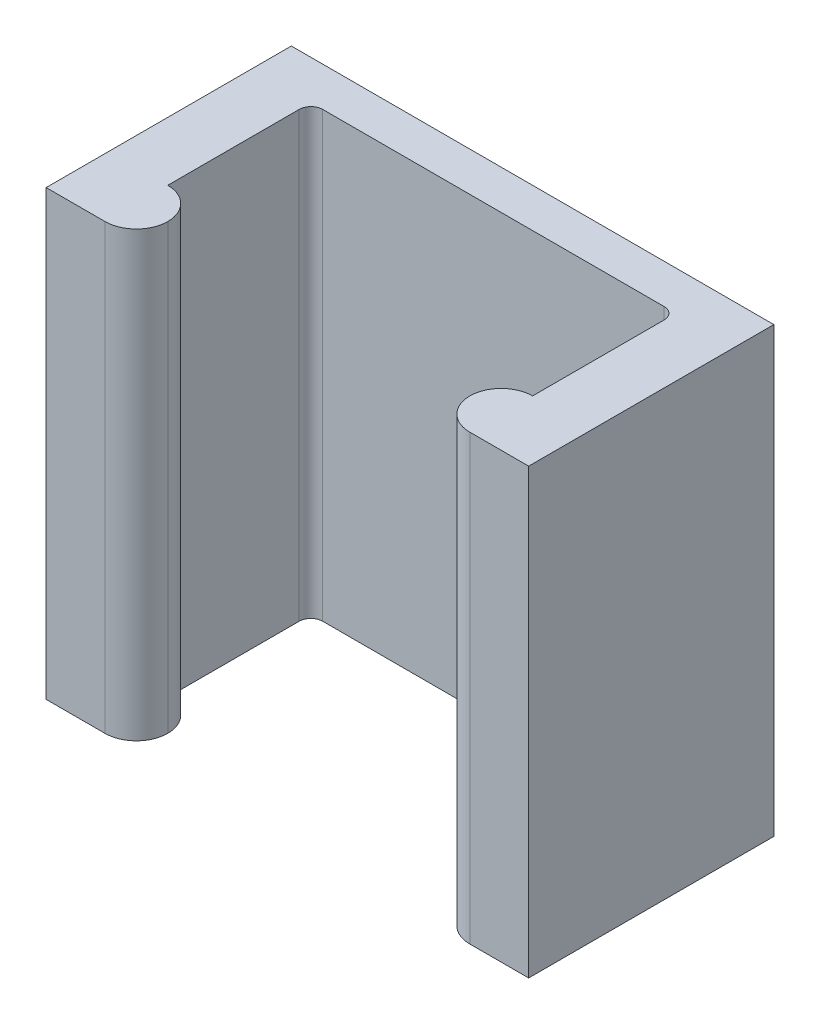
ISO-10303-21;
HEADER;
FILE_DESCRIPTION(('STEP AP214'),'2;1');
FILE_NAME('part.step','',(''),(''),'','','');
FILE_SCHEMA(('AUTOMOTIVE_DESIGN { 1 0 10303 214 1 1 1 1 }'));
ENDSEC;
DATA;
#1=APPLICATION_CONTEXT('core data for automotive mechanical design processes');
#2=APPLICATION_PROTOCOL_DEFINITION('international standard','automotive_design',2000,#1);
#3=PRODUCT_CONTEXT('',#1,'mechanical');
#4=PRODUCT('Part','Part','',(#3));
#5=PRODUCT_RELATED_PRODUCT_CATEGORY('part','',(#4));
#6=PRODUCT_DEFINITION_FORMATION('','',#4);
#7=PRODUCT_DEFINITION_CONTEXT('part definition',#1,'design');
#8=PRODUCT_DEFINITION('design','',#6,#7);
#9=PRODUCT_DEFINITION_SHAPE('','',#8);
#10=(LENGTH_UNIT() NAMED_UNIT(*) SI_UNIT(.MILLI.,.METRE.));
#11=(NAMED_UNIT(*) PLANE_ANGLE_UNIT() SI_UNIT($,.RADIAN.));
#12=(NAMED_UNIT(*) SI_UNIT($,.STERADIAN.) SOLID_ANGLE_UNIT());
#13=UNCERTAINTY_MEASURE_WITH_UNIT(LENGTH_MEASURE(1.E-05),#10,'distance_accuracy_value','');
#14=(GEOMETRIC_REPRESENTATION_CONTEXT(3) GLOBAL_UNCERTAINTY_ASSIGNED_CONTEXT((#13)) GLOBAL_UNIT_ASSIGNED_CONTEXT((#10,
#11,#12)) REPRESENTATION_CONTEXT('',''));
#15=CARTESIAN_POINT('',(0.,0.,0.));
#16=DIRECTION('',(0.,0.,1.));
#17=DIRECTION('',(1.,0.,0.));
#18=AXIS2_PLACEMENT_3D('',#15,#16,#17);
#19=CARTESIAN_POINT('',(4.65,5.65,6.25));
#20=DIRECTION('',(1.,0.,0.));
#21=DIRECTION('',(0.,1.,0.));
#22=AXIS2_PLACEMENT_3D('',#19,#20,#21);
#23=PLANE('',#22);
#24=DIRECTION('',(0.,0.,-1.));
#25=VECTOR('',#24,1.);
#26=CARTESIAN_POINT('',(4.65,5.65,6.25));
#27=LINE('',#26,#25);
#28=CARTESIAN_POINT('',(4.65,5.65,4.65));
#29=VERTEX_POINT('',#28);
#30=CARTESIAN_POINT('',(4.65,5.65,1.3));
#31=VERTEX_POINT('',#30);
#32=EDGE_CURVE('E146',#29,#31,#27,.T.);
#33=ORIENTED_EDGE('',*,*,#32,.T.);
#34=DIRECTION('',(0.,1.,0.));
#35=VECTOR('',#34,1.);
#36=CARTESIAN_POINT('',(4.65,-5.65,1.3));
#37=LINE('',#36,#35);
#38=CARTESIAN_POINT('',(4.65,-5.65,1.3));
#39=VERTEX_POINT('',#38);
#40=EDGE_CURVE('E214',#31,#39,#37,.F.);
#41=ORIENTED_EDGE('',*,*,#40,.T.);
#42=DIRECTION('',(0.,0.,-1.));
#43=VECTOR('',#42,1.);
#44=CARTESIAN_POINT('',(4.65,-5.65,6.25));
#45=LINE('',#44,#43);
#46=CARTESIAN_POINT('',(4.65,-5.65,4.65));
#47=VERTEX_POINT('',#46);
#48=EDGE_CURVE('E149',#47,#39,#45,.T.);
#49=ORIENTED_EDGE('',*,*,#48,.F.);
#50=DIRECTION('',(0.,-1.,0.));
#51=VECTOR('',#50,1.);
#52=CARTESIAN_POINT('',(4.65,-5.65,4.65));
#53=LINE('',#52,#51);
#54=EDGE_CURVE('E144',#29,#47,#53,.T.);
#55=ORIENTED_EDGE('',*,*,#54,.F.);
#56=EDGE_LOOP('',(#33,#41,#49,#55));
#57=FACE_BOUND('',#56,.T.);
#58=ADVANCED_FACE('F41',(#57),#23,.F.);
#59=CARTESIAN_POINT('',(-4.65,5.65,6.25));
#60=DIRECTION('',(-1.,0.,0.));
#61=DIRECTION('',(0.,-1.,0.));
#62=AXIS2_PLACEMENT_3D('',#59,#60,#61);
#63=PLANE('',#62);
#64=DIRECTION('',(0.,0.,-1.));
#65=VECTOR('',#64,1.);
#66=CARTESIAN_POINT('',(-4.65,-5.65,6.25));
#67=LINE('',#66,#65);
#68=CARTESIAN_POINT('',(-4.65,-5.65,4.65));
#69=VERTEX_POINT('',#68);
#70=CARTESIAN_POINT('',(-4.65,-5.65,1.3));
#71=VERTEX_POINT('',#70);
#72=EDGE_CURVE('E326',#69,#71,#67,.T.);
#73=ORIENTED_EDGE('',*,*,#72,.T.);
#74=DIRECTION('',(0.,-1.,0.));
#75=VECTOR('',#74,1.);
#76=CARTESIAN_POINT('',(-4.65,5.65,1.3));
#77=LINE('',#76,#75);
#78=CARTESIAN_POINT('',(-4.65,5.65,1.3));
#79=VERTEX_POINT('',#78);
#80=EDGE_CURVE('E57',#71,#79,#77,.F.);
#81=ORIENTED_EDGE('',*,*,#80,.T.);
#82=DIRECTION('',(0.,0.,-1.));
#83=VECTOR('',#82,1.);
#84=CARTESIAN_POINT('',(-4.65,5.65,6.25));
#85=LINE('',#84,#83);
#86=CARTESIAN_POINT('',(-4.65,5.65,4.65));
#87=VERTEX_POINT('',#86);
#88=EDGE_CURVE('E323',#87,#79,#85,.T.);
#89=ORIENTED_EDGE('',*,*,#88,.F.);
#90=DIRECTION('',(0.,1.,0.));
#91=VECTOR('',#90,1.);
#92=CARTESIAN_POINT('',(-4.65,5.65,4.65));
#93=LINE('',#92,#91);
#94=EDGE_CURVE('E154',#69,#87,#93,.T.);
#95=ORIENTED_EDGE('',*,*,#94,.F.);
#96=EDGE_LOOP('',(#73,#81,#89,#95));
#97=FACE_BOUND('',#96,.T.);
#98=ADVANCED_FACE('F251',(#97),#63,.F.);
#99=CARTESIAN_POINT('',(6.15,-5.65,2.));
#100=DIRECTION('',(-1.,0.,0.));
#101=DIRECTION('',(0.,0.,1.));
#102=AXIS2_PLACEMENT_3D('',#99,#100,#101);
#103=PLANE('',#102);
#104=DIRECTION('',(0.,1.,0.));
#105=VECTOR('',#104,1.);
#106=CARTESIAN_POINT('',(6.15,-5.65,0.));
#107=LINE('',#106,#105);
#108=CARTESIAN_POINT('',(6.15,-5.65,0.));
#109=VERTEX_POINT('',#108);
#110=CARTESIAN_POINT('',(6.15,5.65,0.));
#111=VERTEX_POINT('',#110);
#112=EDGE_CURVE('E329',#109,#111,#107,.T.);
#113=ORIENTED_EDGE('',*,*,#112,.T.);
#114=DIRECTION('',(0.,0.,-1.));
#115=VECTOR('',#114,1.);
#116=CARTESIAN_POINT('',(6.15,5.65,2.));
#117=LINE('',#116,#115);
#118=CARTESIAN_POINT('',(6.15,5.65,6.25));
#119=VERTEX_POINT('',#118);
#120=EDGE_CURVE('E236',#119,#111,#117,.T.);
#121=ORIENTED_EDGE('',*,*,#120,.F.);
#122=DIRECTION('',(0.,1.,0.));
#123=VECTOR('',#122,1.);
#124=CARTESIAN_POINT('',(6.15,5.65,6.25));
#125=LINE('',#124,#123);
#126=CARTESIAN_POINT('',(6.15,-5.65,6.25));
#127=VERTEX_POINT('',#126);
#128=EDGE_CURVE('E298',#127,#119,#125,.T.);
#129=ORIENTED_EDGE('',*,*,#128,.F.);
#130=DIRECTION('',(0.,0.,-1.));
#131=VECTOR('',#130,1.);
#132=CARTESIAN_POINT('',(6.15,-5.65,2.));
#133=LINE('',#132,#131);
#134=EDGE_CURVE('E342',#127,#109,#133,.T.);
#135=ORIENTED_EDGE('',*,*,#134,.T.);
#136=EDGE_LOOP('',(#113,#121,#129,#135));
#137=FACE_BOUND('',#136,.T.);
#138=ADVANCED_FACE('F256',(#137),#103,.F.);
#139=CARTESIAN_POINT('',(-6.15,5.65,2.));
#140=DIRECTION('',(0.,-1.,0.));
#141=DIRECTION('',(0.,0.,-1.));
#142=AXIS2_PLACEMENT_3D('',#139,#140,#141);
#143=PLANE('',#142);
#144=CARTESIAN_POINT('',(4.65,5.65,5.45));
#145=DIRECTION('',(0.,-1.,0.));
#146=DIRECTION('',(0.,0.,-1.));
#147=AXIS2_PLACEMENT_3D('',#144,#145,#146);
#148=CIRCLE('',#147,0.8);
#149=CARTESIAN_POINT('',(3.85,5.65,5.45));
#150=VERTEX_POINT('',#149);
#151=EDGE_CURVE('E159',#29,#150,#148,.F.);
#152=ORIENTED_EDGE('',*,*,#151,.T.);
#153=CARTESIAN_POINT('',(4.65,5.65,5.45));
#154=DIRECTION('',(0.,-1.,0.));
#155=DIRECTION('',(0.,0.,-1.));
#156=AXIS2_PLACEMENT_3D('',#153,#154,#155);
#157=CIRCLE('',#156,0.8);
#158=CARTESIAN_POINT('',(4.65,5.65,6.25));
#159=VERTEX_POINT('',#158);
#160=EDGE_CURVE('E170',#150,#159,#157,.F.);
#161=ORIENTED_EDGE('',*,*,#160,.T.);
#162=DIRECTION('',(-1.,0.,0.));
#163=VECTOR('',#162,1.);
#164=CARTESIAN_POINT('',(6.15,5.65,6.25));
#165=LINE('',#164,#163);
#166=EDGE_CURVE('E304',#119,#159,#165,.T.);
#167=ORIENTED_EDGE('',*,*,#166,.F.);
#168=ORIENTED_EDGE('',*,*,#120,.T.);
#169=DIRECTION('',(-1.,0.,0.));
#170=VECTOR('',#169,1.);
#171=CARTESIAN_POINT('',(-6.15,5.65,0.));
#172=LINE('',#171,#170);
#173=CARTESIAN_POINT('',(-6.15,5.65,0.));
#174=VERTEX_POINT('',#173);
#175=EDGE_CURVE('E333',#111,#174,#172,.T.);
#176=ORIENTED_EDGE('',*,*,#175,.T.);
#177=DIRECTION('',(0.,0.,-1.));
#178=VECTOR('',#177,1.);
#179=CARTESIAN_POINT('',(-6.15,5.65,2.));
#180=LINE('',#179,#178);
#181=CARTESIAN_POINT('',(-6.15,5.65,6.25));
#182=VERTEX_POINT('',#181);
#183=EDGE_CURVE('E350',#182,#174,#180,.T.);
#184=ORIENTED_EDGE('',*,*,#183,.F.);
#185=DIRECTION('',(-1.,0.,0.));
#186=VECTOR('',#185,1.);
#187=CARTESIAN_POINT('',(-6.15,5.65,6.25));
#188=LINE('',#187,#186);
#189=CARTESIAN_POINT('',(-4.65,5.65,6.25));
#190=VERTEX_POINT('',#189);
#191=EDGE_CURVE('E320',#190,#182,#188,.T.);
#192=ORIENTED_EDGE('',*,*,#191,.F.);
#193=CARTESIAN_POINT('',(-4.65,5.65,5.45));
#194=DIRECTION('',(0.,-1.,0.));
#195=DIRECTION('',(0.,0.,-1.));
#196=AXIS2_PLACEMENT_3D('',#193,#194,#195);
#197=CIRCLE('',#196,0.8);
#198=CARTESIAN_POINT('',(-3.85,5.65,5.45));
#199=VERTEX_POINT('',#198);
#200=EDGE_CURVE('E171',#190,#199,#197,.F.);
#201=ORIENTED_EDGE('',*,*,#200,.T.);
#202=CARTESIAN_POINT('',(-4.65,5.65,5.45));
#203=DIRECTION('',(0.,-1.,0.));
#204=DIRECTION('',(0.,0.,-1.));
#205=AXIS2_PLACEMENT_3D('',#202,#203,#204);
#206=CIRCLE('',#205,0.8);
#207=EDGE_CURVE('E177',#199,#87,#206,.F.);
#208=ORIENTED_EDGE('',*,*,#207,.T.);
#209=ORIENTED_EDGE('',*,*,#88,.T.);
#210=CARTESIAN_POINT('',(-4.35,5.65,1.3));
#211=DIRECTION('',(0.,-1.,0.));
#212=DIRECTION('',(0.,0.,-1.));
#213=AXIS2_PLACEMENT_3D('',#210,#211,#212);
#214=CIRCLE('',#213,0.3);
#215=CARTESIAN_POINT('',(-4.35,5.65,1.));
#216=VERTEX_POINT('',#215);
#217=EDGE_CURVE('E11',#79,#216,#214,.T.);
#218=ORIENTED_EDGE('',*,*,#217,.T.);
#219=DIRECTION('',(1.,0.,0.));
#220=VECTOR('',#219,1.);
#221=CARTESIAN_POINT('',(-6.15,5.65,1.));
#222=LINE('',#221,#220);
#223=CARTESIAN_POINT('',(4.35,5.65,1.));
#224=VERTEX_POINT('',#223);
#225=EDGE_CURVE('E295',#216,#224,#222,.T.);
#226=ORIENTED_EDGE('',*,*,#225,.T.);
#227=CARTESIAN_POINT('',(4.35,5.65,1.3));
#228=DIRECTION('',(0.,-1.,0.));
#229=DIRECTION('',(0.,0.,-1.));
#230=AXIS2_PLACEMENT_3D('',#227,#228,#229);
#231=CIRCLE('',#230,0.3);
#232=EDGE_CURVE('E162',#224,#31,#231,.T.);
#233=ORIENTED_EDGE('',*,*,#232,.T.);
#234=ORIENTED_EDGE('',*,*,#32,.F.);
#235=EDGE_LOOP('',(#152,#161,#167,#168,#176,#184,#192,#201,#208,#209,#218,#226,#233,#234));
#236=FACE_BOUND('',#235,.T.);
#237=ADVANCED_FACE('F158',(#236),#143,.F.);
#238=CARTESIAN_POINT('',(-6.15,-5.65,2.));
#239=DIRECTION('',(1.,0.,0.));
#240=DIRECTION('',(0.,0.,-1.));
#241=AXIS2_PLACEMENT_3D('',#238,#239,#240);
#242=PLANE('',#241);
#243=DIRECTION('',(0.,-1.,0.));
#244=VECTOR('',#243,1.);
#245=CARTESIAN_POINT('',(-6.15,-5.65,0.));
#246=LINE('',#245,#244);
#247=CARTESIAN_POINT('',(-6.15,-5.65,0.));
#248=VERTEX_POINT('',#247);
#249=EDGE_CURVE('E336',#174,#248,#246,.T.);
#250=ORIENTED_EDGE('',*,*,#249,.T.);
#251=DIRECTION('',(0.,0.,-1.));
#252=VECTOR('',#251,1.);
#253=CARTESIAN_POINT('',(-6.15,-5.65,2.));
#254=LINE('',#253,#252);
#255=CARTESIAN_POINT('',(-6.15,-5.65,6.25));
#256=VERTEX_POINT('',#255);
#257=EDGE_CURVE('E346',#256,#248,#254,.T.);
#258=ORIENTED_EDGE('',*,*,#257,.F.);
#259=DIRECTION('',(0.,-1.,0.));
#260=VECTOR('',#259,1.);
#261=CARTESIAN_POINT('',(-6.15,5.65,6.25));
#262=LINE('',#261,#260);
#263=EDGE_CURVE('E164',#182,#256,#262,.T.);
#264=ORIENTED_EDGE('',*,*,#263,.F.);
#265=ORIENTED_EDGE('',*,*,#183,.T.);
#266=EDGE_LOOP('',(#250,#258,#264,#265));
#267=FACE_BOUND('',#266,.T.);
#268=ADVANCED_FACE('F272',(#267),#242,.F.);
#269=CARTESIAN_POINT('',(-6.15,-5.65,2.));
#270=DIRECTION('',(0.,1.,0.));
#271=DIRECTION('',(0.,0.,1.));
#272=AXIS2_PLACEMENT_3D('',#269,#270,#271);
#273=PLANE('',#272);
#274=DIRECTION('',(1.,0.,0.));
#275=VECTOR('',#274,1.);
#276=CARTESIAN_POINT('',(6.15,-5.65,6.25));
#277=LINE('',#276,#275);
#278=CARTESIAN_POINT('',(4.65,-5.65,6.25));
#279=VERTEX_POINT('',#278);
#280=EDGE_CURVE('E308',#279,#127,#277,.T.);
#281=ORIENTED_EDGE('',*,*,#280,.F.);
#282=CARTESIAN_POINT('',(4.65,-5.65,5.45));
#283=DIRECTION('',(0.,1.,0.));
#284=DIRECTION('',(0.,0.,1.));
#285=AXIS2_PLACEMENT_3D('',#282,#283,#284);
#286=CIRCLE('',#285,0.8);
#287=CARTESIAN_POINT('',(3.85,-5.65,5.45));
#288=VERTEX_POINT('',#287);
#289=EDGE_CURVE('E193',#279,#288,#286,.F.);
#290=ORIENTED_EDGE('',*,*,#289,.T.);
#291=CARTESIAN_POINT('',(4.65,-5.65,5.45));
#292=DIRECTION('',(0.,1.,0.));
#293=DIRECTION('',(0.,0.,1.));
#294=AXIS2_PLACEMENT_3D('',#291,#292,#293);
#295=CIRCLE('',#294,0.8);
#296=EDGE_CURVE('E190',#288,#47,#295,.F.);
#297=ORIENTED_EDGE('',*,*,#296,.T.);
#298=ORIENTED_EDGE('',*,*,#48,.T.);
#299=CARTESIAN_POINT('',(4.35,-5.65,1.3));
#300=DIRECTION('',(0.,1.,0.));
#301=DIRECTION('',(0.,0.,1.));
#302=AXIS2_PLACEMENT_3D('',#299,#300,#301);
#303=CIRCLE('',#302,0.3);
#304=CARTESIAN_POINT('',(4.35,-5.65,1.));
#305=VERTEX_POINT('',#304);
#306=EDGE_CURVE('E221',#39,#305,#303,.T.);
#307=ORIENTED_EDGE('',*,*,#306,.T.);
#308=DIRECTION('',(-1.,0.,0.));
#309=VECTOR('',#308,1.);
#310=CARTESIAN_POINT('',(-6.15,-5.65,1.));
#311=LINE('',#310,#309);
#312=CARTESIAN_POINT('',(-4.35,-5.65,1.));
#313=VERTEX_POINT('',#312);
#314=EDGE_CURVE('E228',#305,#313,#311,.T.);
#315=ORIENTED_EDGE('',*,*,#314,.T.);
#316=CARTESIAN_POINT('',(-4.35,-5.65,1.3));
#317=DIRECTION('',(0.,1.,0.));
#318=DIRECTION('',(0.,0.,1.));
#319=AXIS2_PLACEMENT_3D('',#316,#317,#318);
#320=CIRCLE('',#319,0.3);
#321=EDGE_CURVE('E50',#313,#71,#320,.T.);
#322=ORIENTED_EDGE('',*,*,#321,.T.);
#323=ORIENTED_EDGE('',*,*,#72,.F.);
#324=CARTESIAN_POINT('',(-4.65,-5.65,5.45));
#325=DIRECTION('',(0.,1.,0.));
#326=DIRECTION('',(0.,0.,1.));
#327=AXIS2_PLACEMENT_3D('',#324,#325,#326);
#328=CIRCLE('',#327,0.8);
#329=CARTESIAN_POINT('',(-3.85,-5.65,5.45));
#330=VERTEX_POINT('',#329);
#331=EDGE_CURVE('E184',#69,#330,#328,.F.);
#332=ORIENTED_EDGE('',*,*,#331,.T.);
#333=CARTESIAN_POINT('',(-4.65,-5.65,5.45));
#334=DIRECTION('',(0.,1.,0.));
#335=DIRECTION('',(0.,0.,1.));
#336=AXIS2_PLACEMENT_3D('',#333,#334,#335);
#337=CIRCLE('',#336,0.8);
#338=CARTESIAN_POINT('',(-4.65,-5.65,6.25));
#339=VERTEX_POINT('',#338);
#340=EDGE_CURVE('E187',#330,#339,#337,.F.);
#341=ORIENTED_EDGE('',*,*,#340,.T.);
#342=DIRECTION('',(1.,0.,0.));
#343=VECTOR('',#342,1.);
#344=CARTESIAN_POINT('',(-6.15,-5.65,6.25));
#345=LINE('',#344,#343);
#346=EDGE_CURVE('E316',#256,#339,#345,.T.);
#347=ORIENTED_EDGE('',*,*,#346,.F.);
#348=ORIENTED_EDGE('',*,*,#257,.T.);
#349=DIRECTION('',(1.,0.,0.));
#350=VECTOR('',#349,1.);
#351=CARTESIAN_POINT('',(-6.15,-5.65,0.));
#352=LINE('',#351,#350);
#353=EDGE_CURVE('E339',#248,#109,#352,.T.);
#354=ORIENTED_EDGE('',*,*,#353,.T.);
#355=ORIENTED_EDGE('',*,*,#134,.F.);
#356=EDGE_LOOP('',(#281,#290,#297,#298,#307,#315,#322,#323,#332,#341,#347,#348,#354,#355));
#357=FACE_BOUND('',#356,.T.);
#358=ADVANCED_FACE('F227',(#357),#273,.F.);
#359=CARTESIAN_POINT('',(0.,0.,0.));
#360=DIRECTION('',(0.,0.,-1.));
#361=DIRECTION('',(-1.,0.,0.));
#362=AXIS2_PLACEMENT_3D('',#359,#360,#361);
#363=PLANE('',#362);
#364=ORIENTED_EDGE('',*,*,#112,.F.);
#365=ORIENTED_EDGE('',*,*,#353,.F.);
#366=ORIENTED_EDGE('',*,*,#249,.F.);
#367=ORIENTED_EDGE('',*,*,#175,.F.);
#368=EDGE_LOOP('',(#364,#365,#366,#367));
#369=FACE_BOUND('',#368,.T.);
#370=ADVANCED_FACE('F264',(#369),#363,.T.);
#371=CARTESIAN_POINT('',(0.,0.,6.25));
#372=DIRECTION('',(0.,0.,1.));
#373=DIRECTION('',(1.,0.,0.));
#374=AXIS2_PLACEMENT_3D('',#371,#372,#373);
#375=PLANE('',#374);
#376=ORIENTED_EDGE('',*,*,#346,.T.);
#377=DIRECTION('',(0.,-1.,0.));
#378=VECTOR('',#377,1.);
#379=CARTESIAN_POINT('',(-4.65,0.,6.25));
#380=LINE('',#379,#378);
#381=EDGE_CURVE('E196',#339,#190,#380,.F.);
#382=ORIENTED_EDGE('',*,*,#381,.T.);
#383=ORIENTED_EDGE('',*,*,#191,.T.);
#384=ORIENTED_EDGE('',*,*,#263,.T.);
#385=EDGE_LOOP('',(#376,#382,#383,#384));
#386=FACE_BOUND('',#385,.T.);
#387=ADVANCED_FACE('F262',(#386),#375,.T.);
#388=CARTESIAN_POINT('',(0.,0.,6.25));
#389=DIRECTION('',(0.,0.,-1.));
#390=DIRECTION('',(-1.,0.,0.));
#391=AXIS2_PLACEMENT_3D('',#388,#389,#390);
#392=PLANE('',#391);
#393=ORIENTED_EDGE('',*,*,#166,.T.);
#394=DIRECTION('',(0.,1.,0.));
#395=VECTOR('',#394,1.);
#396=CARTESIAN_POINT('',(4.65,-5.65,6.25));
#397=LINE('',#396,#395);
#398=EDGE_CURVE('E175',#159,#279,#397,.F.);
#399=ORIENTED_EDGE('',*,*,#398,.T.);
#400=ORIENTED_EDGE('',*,*,#280,.T.);
#401=ORIENTED_EDGE('',*,*,#128,.T.);
#402=EDGE_LOOP('',(#393,#399,#400,#401));
#403=FACE_BOUND('',#402,.T.);
#404=ADVANCED_FACE('F260',(#403),#392,.F.);
#405=CARTESIAN_POINT('',(0.,0.,1.));
#406=DIRECTION('',(0.,0.,-1.));
#407=DIRECTION('',(-1.,0.,0.));
#408=AXIS2_PLACEMENT_3D('',#405,#406,#407);
#409=PLANE('',#408);
#410=ORIENTED_EDGE('',*,*,#314,.F.);
#411=DIRECTION('',(0.,1.,0.));
#412=VECTOR('',#411,1.);
#413=CARTESIAN_POINT('',(4.35,5.65,1.));
#414=LINE('',#413,#412);
#415=EDGE_CURVE('E210',#305,#224,#414,.T.);
#416=ORIENTED_EDGE('',*,*,#415,.T.);
#417=ORIENTED_EDGE('',*,*,#225,.F.);
#418=DIRECTION('',(0.,-1.,0.));
#419=VECTOR('',#418,1.);
#420=CARTESIAN_POINT('',(-4.35,-5.65,1.));
#421=LINE('',#420,#419);
#422=EDGE_CURVE('E200',#216,#313,#421,.T.);
#423=ORIENTED_EDGE('',*,*,#422,.T.);
#424=EDGE_LOOP('',(#410,#416,#417,#423));
#425=FACE_BOUND('',#424,.T.);
#426=ADVANCED_FACE('F232',(#425),#409,.F.);
#427=CARTESIAN_POINT('',(4.65,0.,5.45));
#428=DIRECTION('',(0.,1.,0.));
#429=DIRECTION('',(-1.,0.,0.));
#430=AXIS2_PLACEMENT_3D('',#427,#428,#429);
#431=CYLINDRICAL_SURFACE('',#430,0.8);
#432=ORIENTED_EDGE('',*,*,#54,.T.);
#433=ORIENTED_EDGE('',*,*,#296,.F.);
#434=DIRECTION('',(0.,-1.,0.));
#435=VECTOR('',#434,1.);
#436=CARTESIAN_POINT('',(3.85,-5.65,5.45));
#437=LINE('',#436,#435);
#438=EDGE_CURVE('E155',#150,#288,#437,.T.);
#439=ORIENTED_EDGE('',*,*,#438,.F.);
#440=ORIENTED_EDGE('',*,*,#151,.F.);
#441=EDGE_LOOP('',(#432,#433,#439,#440));
#442=FACE_BOUND('',#441,.T.);
#443=ADVANCED_FACE('F166',(#442),#431,.T.);
#444=CARTESIAN_POINT('',(4.65,0.,5.45));
#445=DIRECTION('',(0.,-1.,0.));
#446=DIRECTION('',(1.,0.,0.));
#447=AXIS2_PLACEMENT_3D('',#444,#445,#446);
#448=CYLINDRICAL_SURFACE('',#447,0.8);
#449=ORIENTED_EDGE('',*,*,#289,.F.);
#450=ORIENTED_EDGE('',*,*,#398,.F.);
#451=ORIENTED_EDGE('',*,*,#160,.F.);
#452=ORIENTED_EDGE('',*,*,#438,.T.);
#453=EDGE_LOOP('',(#449,#450,#451,#452));
#454=FACE_BOUND('',#453,.T.);
#455=ADVANCED_FACE('F281',(#454),#448,.T.);
#456=CARTESIAN_POINT('',(-4.65,0.,5.45));
#457=DIRECTION('',(0.,-1.,0.));
#458=DIRECTION('',(1.,0.,0.));
#459=AXIS2_PLACEMENT_3D('',#456,#457,#458);
#460=CYLINDRICAL_SURFACE('',#459,0.8);
#461=ORIENTED_EDGE('',*,*,#94,.T.);
#462=ORIENTED_EDGE('',*,*,#207,.F.);
#463=DIRECTION('',(0.,1.,0.));
#464=VECTOR('',#463,1.);
#465=CARTESIAN_POINT('',(-3.85,5.65,5.45));
#466=LINE('',#465,#464);
#467=EDGE_CURVE('E203',#330,#199,#466,.T.);
#468=ORIENTED_EDGE('',*,*,#467,.F.);
#469=ORIENTED_EDGE('',*,*,#331,.F.);
#470=EDGE_LOOP('',(#461,#462,#468,#469));
#471=FACE_BOUND('',#470,.T.);
#472=ADVANCED_FACE('F246',(#471),#460,.T.);
#473=CARTESIAN_POINT('',(-4.65,0.,5.45));
#474=DIRECTION('',(0.,-1.,0.));
#475=DIRECTION('',(1.,0.,0.));
#476=AXIS2_PLACEMENT_3D('',#473,#474,#475);
#477=CYLINDRICAL_SURFACE('',#476,0.8);
#478=ORIENTED_EDGE('',*,*,#200,.F.);
#479=ORIENTED_EDGE('',*,*,#381,.F.);
#480=ORIENTED_EDGE('',*,*,#340,.F.);
#481=ORIENTED_EDGE('',*,*,#467,.T.);
#482=EDGE_LOOP('',(#478,#479,#480,#481));
#483=FACE_BOUND('',#482,.T.);
#484=ADVANCED_FACE('F240',(#483),#477,.T.);
#485=CARTESIAN_POINT('',(4.35,0.,1.3));
#486=DIRECTION('',(0.,-1.,0.));
#487=DIRECTION('',(1.,0.,0.));
#488=AXIS2_PLACEMENT_3D('',#485,#486,#487);
#489=CYLINDRICAL_SURFACE('',#488,0.3);
#490=ORIENTED_EDGE('',*,*,#306,.F.);
#491=ORIENTED_EDGE('',*,*,#40,.F.);
#492=ORIENTED_EDGE('',*,*,#232,.F.);
#493=ORIENTED_EDGE('',*,*,#415,.F.);
#494=EDGE_LOOP('',(#490,#491,#492,#493));
#495=FACE_BOUND('',#494,.T.);
#496=ADVANCED_FACE('F238',(#495),#489,.F.);
#497=CARTESIAN_POINT('',(-4.35,0.,1.3));
#498=DIRECTION('',(0.,1.,0.));
#499=DIRECTION('',(-1.,0.,0.));
#500=AXIS2_PLACEMENT_3D('',#497,#498,#499);
#501=CYLINDRICAL_SURFACE('',#500,0.3);
#502=ORIENTED_EDGE('',*,*,#217,.F.);
#503=ORIENTED_EDGE('',*,*,#80,.F.);
#504=ORIENTED_EDGE('',*,*,#321,.F.);
#505=ORIENTED_EDGE('',*,*,#422,.F.);
#506=EDGE_LOOP('',(#502,#503,#504,#505));
#507=FACE_BOUND('',#506,.T.);
#508=ADVANCED_FACE('F43',(#507),#501,.F.);
#509=CLOSED_SHELL('',(#58,#98,#138,#237,#268,#358,#370,#387,#404,#426,#443,#455,#472,#484,#496,#508));
#510=MANIFOLD_SOLID_BREP('B2',#509);
#511=ADVANCED_BREP_SHAPE_REPRESENTATION('',(#18,#510),#14);
#512=SHAPE_DEFINITION_REPRESENTATION(#9,#511);
ENDSEC;
END-ISO-10303-21;
